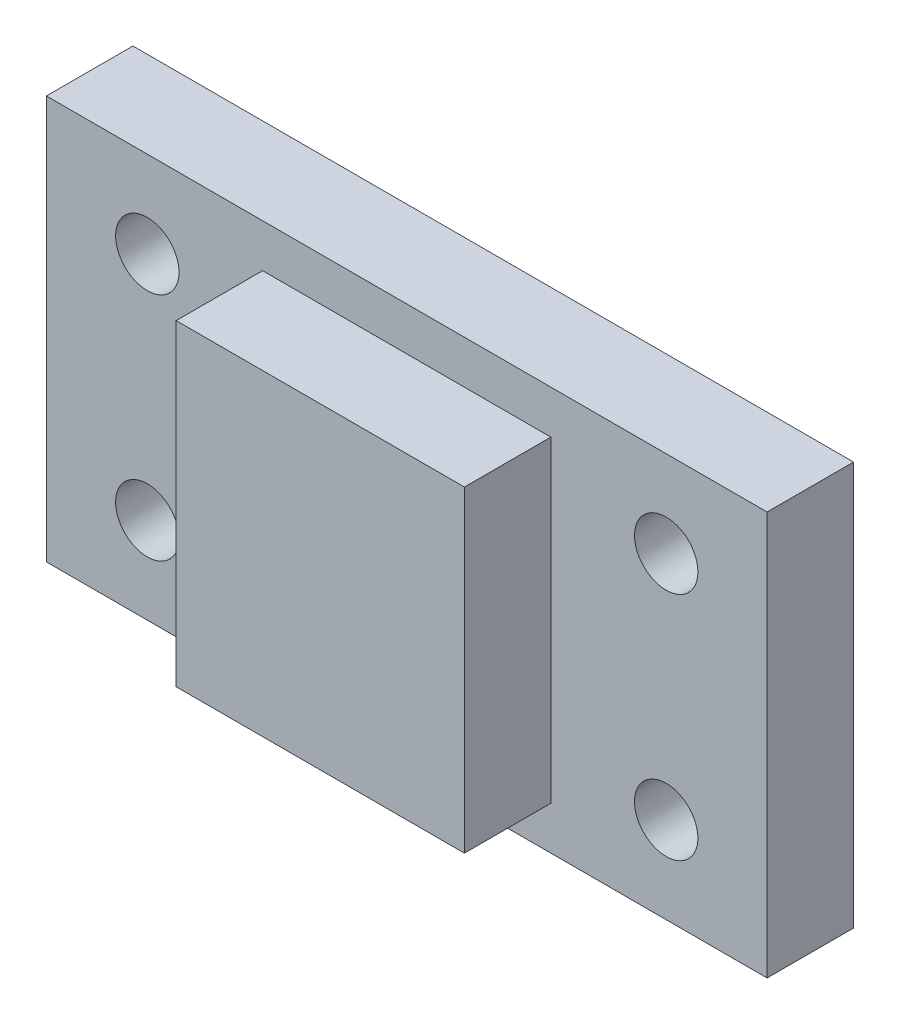
ISO-10303-21;
HEADER;
FILE_DESCRIPTION(('STEP AP214'),'2;1');
FILE_NAME('part.step','',(''),(''),'','','');
FILE_SCHEMA(('AUTOMOTIVE_DESIGN { 1 0 10303 214 1 1 1 1 }'));
ENDSEC;
DATA;
#1=APPLICATION_CONTEXT('core data for automotive mechanical design processes');
#2=APPLICATION_PROTOCOL_DEFINITION('international standard','automotive_design',2000,#1);
#3=PRODUCT_CONTEXT('',#1,'mechanical');
#4=PRODUCT('Part','Part','',(#3));
#5=PRODUCT_RELATED_PRODUCT_CATEGORY('part','',(#4));
#6=PRODUCT_DEFINITION_FORMATION('','',#4);
#7=PRODUCT_DEFINITION_CONTEXT('part definition',#1,'design');
#8=PRODUCT_DEFINITION('design','',#6,#7);
#9=PRODUCT_DEFINITION_SHAPE('','',#8);
#10=(LENGTH_UNIT() NAMED_UNIT(*) SI_UNIT(.MILLI.,.METRE.));
#11=(NAMED_UNIT(*) PLANE_ANGLE_UNIT() SI_UNIT($,.RADIAN.));
#12=(NAMED_UNIT(*) SI_UNIT($,.STERADIAN.) SOLID_ANGLE_UNIT());
#13=UNCERTAINTY_MEASURE_WITH_UNIT(LENGTH_MEASURE(1.E-05),#10,'distance_accuracy_value','');
#14=(GEOMETRIC_REPRESENTATION_CONTEXT(3) GLOBAL_UNCERTAINTY_ASSIGNED_CONTEXT((#13)) GLOBAL_UNIT_ASSIGNED_CONTEXT((#10,
#11,#12)) REPRESENTATION_CONTEXT('',''));
#15=CARTESIAN_POINT('',(0.,0.,0.));
#16=DIRECTION('',(0.,0.,1.));
#17=DIRECTION('',(1.,0.,0.));
#18=AXIS2_PLACEMENT_3D('',#15,#16,#17);
#19=CARTESIAN_POINT('',(64.5,-91.,22.));
#20=DIRECTION('',(0.,0.,-1.));
#21=DIRECTION('',(0.,-1.,0.));
#22=AXIS2_PLACEMENT_3D('',#19,#20,#21);
#23=PLANE('',#22);
#24=DIRECTION('',(0.,1.,0.));
#25=VECTOR('',#24,1.);
#26=CARTESIAN_POINT('',(10.,-96.5,22.));
#27=LINE('',#26,#25);
#28=CARTESIAN_POINT('',(10.,-102.,22.));
#29=VERTEX_POINT('',#28);
#30=CARTESIAN_POINT('',(10.,-80.,22.));
#31=VERTEX_POINT('',#30);
#32=EDGE_CURVE('E50',#29,#31,#27,.T.);
#33=ORIENTED_EDGE('',*,*,#32,.T.);
#34=DIRECTION('',(-1.,0.,0.));
#35=VECTOR('',#34,1.);
#36=CARTESIAN_POINT('',(27.25,-80.,22.));
#37=LINE('',#36,#35);
#38=CARTESIAN_POINT('',(-10.,-80.,22.));
#39=VERTEX_POINT('',#38);
#40=EDGE_CURVE('E36',#31,#39,#37,.T.);
#41=ORIENTED_EDGE('',*,*,#40,.T.);
#42=DIRECTION('',(0.,1.,0.));
#43=VECTOR('',#42,1.);
#44=CARTESIAN_POINT('',(-10.,-96.5,22.));
#45=LINE('',#44,#43);
#46=CARTESIAN_POINT('',(-10.,-102.,22.));
#47=VERTEX_POINT('',#46);
#48=EDGE_CURVE('E193',#47,#39,#45,.T.);
#49=ORIENTED_EDGE('',*,*,#48,.F.);
#50=DIRECTION('',(-1.,0.,0.));
#51=VECTOR('',#50,1.);
#52=CARTESIAN_POINT('',(27.25,-102.,22.));
#53=LINE('',#52,#51);
#54=EDGE_CURVE('E240',#29,#47,#53,.T.);
#55=ORIENTED_EDGE('',*,*,#54,.F.);
#56=EDGE_LOOP('',(#33,#41,#49,#55));
#57=FACE_BOUND('',#56,.T.);
#58=ADVANCED_FACE('F17',(#57),#23,.F.);
#59=CARTESIAN_POINT('',(18.,-83.,9.));
#60=DIRECTION('',(0.,0.,-1.));
#61=DIRECTION('',(1.,0.,0.));
#62=AXIS2_PLACEMENT_3D('',#59,#60,#61);
#63=CYLINDRICAL_SURFACE('',#62,2.2);
#64=CARTESIAN_POINT('',(18.,-83.,10.));
#65=DIRECTION('',(0.,0.,-1.));
#66=DIRECTION('',(1.,0.,0.));
#67=AXIS2_PLACEMENT_3D('',#64,#65,#66);
#68=CIRCLE('',#67,2.2);
#69=CARTESIAN_POINT('',(20.2,-83.,10.));
#70=VERTEX_POINT('',#69);
#71=EDGE_CURVE('E226',#70,#70,#68,.T.);
#72=ORIENTED_EDGE('',*,*,#71,.T.);
#73=DIRECTION('',(0.,0.,1.));
#74=VECTOR('',#73,1.);
#75=CARTESIAN_POINT('',(20.2,-83.,9.));
#76=LINE('',#75,#74);
#77=CARTESIAN_POINT('',(20.2,-83.,16.));
#78=VERTEX_POINT('',#77);
#79=EDGE_CURVE('E11',#70,#78,#76,.T.);
#80=ORIENTED_EDGE('',*,*,#79,.T.);
#81=CARTESIAN_POINT('',(18.,-83.,16.));
#82=DIRECTION('',(0.,0.,-1.));
#83=DIRECTION('',(1.,0.,0.));
#84=AXIS2_PLACEMENT_3D('',#81,#82,#83);
#85=CIRCLE('',#84,2.2);
#86=EDGE_CURVE('E190',#78,#78,#85,.T.);
#87=ORIENTED_EDGE('',*,*,#86,.F.);
#88=ORIENTED_EDGE('',*,*,#79,.F.);
#89=EDGE_LOOP('',(#72,#80,#87,#88));
#90=FACE_BOUND('',#89,.T.);
#91=ADVANCED_FACE('F19',(#90),#63,.F.);
#92=CARTESIAN_POINT('',(-18.,-83.,9.));
#93=DIRECTION('',(0.,0.,-1.));
#94=DIRECTION('',(1.,0.,0.));
#95=AXIS2_PLACEMENT_3D('',#92,#93,#94);
#96=CYLINDRICAL_SURFACE('',#95,2.2);
#97=CARTESIAN_POINT('',(-18.,-83.,10.));
#98=DIRECTION('',(0.,0.,-1.));
#99=DIRECTION('',(1.,0.,0.));
#100=AXIS2_PLACEMENT_3D('',#97,#98,#99);
#101=CIRCLE('',#100,2.2);
#102=CARTESIAN_POINT('',(-15.8,-83.,10.));
#103=VERTEX_POINT('',#102);
#104=EDGE_CURVE('E225',#103,#103,#101,.T.);
#105=ORIENTED_EDGE('',*,*,#104,.T.);
#106=DIRECTION('',(0.,0.,1.));
#107=VECTOR('',#106,1.);
#108=CARTESIAN_POINT('',(-15.8,-83.,9.));
#109=LINE('',#108,#107);
#110=CARTESIAN_POINT('',(-15.8,-83.,16.));
#111=VERTEX_POINT('',#110);
#112=EDGE_CURVE('E27',#103,#111,#109,.T.);
#113=ORIENTED_EDGE('',*,*,#112,.T.);
#114=CARTESIAN_POINT('',(-18.,-83.,16.));
#115=DIRECTION('',(0.,0.,-1.));
#116=DIRECTION('',(1.,0.,0.));
#117=AXIS2_PLACEMENT_3D('',#114,#115,#116);
#118=CIRCLE('',#117,2.2);
#119=EDGE_CURVE('E183',#111,#111,#118,.T.);
#120=ORIENTED_EDGE('',*,*,#119,.F.);
#121=ORIENTED_EDGE('',*,*,#112,.F.);
#122=EDGE_LOOP('',(#105,#113,#120,#121));
#123=FACE_BOUND('',#122,.T.);
#124=ADVANCED_FACE('F309',(#123),#96,.F.);
#125=CARTESIAN_POINT('',(-10.,-80.,16.));
#126=DIRECTION('',(0.,1.,0.));
#127=DIRECTION('',(1.,0.,0.));
#128=AXIS2_PLACEMENT_3D('',#125,#126,#127);
#129=PLANE('',#128);
#130=DIRECTION('',(0.,0.,1.));
#131=VECTOR('',#130,1.);
#132=CARTESIAN_POINT('',(10.,-80.,16.));
#133=LINE('',#132,#131);
#134=CARTESIAN_POINT('',(10.,-80.,16.));
#135=VERTEX_POINT('',#134);
#136=EDGE_CURVE('E202',#135,#31,#133,.T.);
#137=ORIENTED_EDGE('',*,*,#136,.F.);
#138=DIRECTION('',(1.,0.,0.));
#139=VECTOR('',#138,1.);
#140=CARTESIAN_POINT('',(-10.,-80.,16.));
#141=LINE('',#140,#139);
#142=CARTESIAN_POINT('',(-10.,-80.,16.));
#143=VERTEX_POINT('',#142);
#144=EDGE_CURVE('E180',#143,#135,#141,.T.);
#145=ORIENTED_EDGE('',*,*,#144,.F.);
#146=DIRECTION('',(0.,0.,1.));
#147=VECTOR('',#146,1.);
#148=CARTESIAN_POINT('',(-10.,-80.,16.));
#149=LINE('',#148,#147);
#150=EDGE_CURVE('E192',#143,#39,#149,.T.);
#151=ORIENTED_EDGE('',*,*,#150,.T.);
#152=ORIENTED_EDGE('',*,*,#40,.F.);
#153=EDGE_LOOP('',(#137,#145,#151,#152));
#154=FACE_BOUND('',#153,.T.);
#155=ADVANCED_FACE('F332',(#154),#129,.T.);
#156=CARTESIAN_POINT('',(10.,-102.,16.));
#157=DIRECTION('',(1.,0.,0.));
#158=DIRECTION('',(0.,1.,0.));
#159=AXIS2_PLACEMENT_3D('',#156,#157,#158);
#160=PLANE('',#159);
#161=ORIENTED_EDGE('',*,*,#32,.F.);
#162=DIRECTION('',(0.,0.,1.));
#163=VECTOR('',#162,1.);
#164=CARTESIAN_POINT('',(10.,-102.,16.));
#165=LINE('',#164,#163);
#166=CARTESIAN_POINT('',(10.,-102.,16.));
#167=VERTEX_POINT('',#166);
#168=EDGE_CURVE('E217',#167,#29,#165,.T.);
#169=ORIENTED_EDGE('',*,*,#168,.F.);
#170=DIRECTION('',(0.,1.,0.));
#171=VECTOR('',#170,1.);
#172=CARTESIAN_POINT('',(10.,-102.,16.));
#173=LINE('',#172,#171);
#174=EDGE_CURVE('E181',#167,#135,#173,.T.);
#175=ORIENTED_EDGE('',*,*,#174,.T.);
#176=ORIENTED_EDGE('',*,*,#136,.T.);
#177=EDGE_LOOP('',(#161,#169,#175,#176));
#178=FACE_BOUND('',#177,.T.);
#179=ADVANCED_FACE('F242',(#178),#160,.T.);
#180=CARTESIAN_POINT('',(-10.,-102.,16.));
#181=DIRECTION('',(0.,1.,0.));
#182=DIRECTION('',(1.,0.,0.));
#183=AXIS2_PLACEMENT_3D('',#180,#181,#182);
#184=PLANE('',#183);
#185=ORIENTED_EDGE('',*,*,#54,.T.);
#186=DIRECTION('',(0.,0.,1.));
#187=VECTOR('',#186,1.);
#188=CARTESIAN_POINT('',(-10.,-102.,16.));
#189=LINE('',#188,#187);
#190=CARTESIAN_POINT('',(-10.,-102.,16.));
#191=VERTEX_POINT('',#190);
#192=EDGE_CURVE('E188',#191,#47,#189,.T.);
#193=ORIENTED_EDGE('',*,*,#192,.F.);
#194=DIRECTION('',(1.,0.,0.));
#195=VECTOR('',#194,1.);
#196=CARTESIAN_POINT('',(-10.,-102.,16.));
#197=LINE('',#196,#195);
#198=EDGE_CURVE('E187',#191,#167,#197,.T.);
#199=ORIENTED_EDGE('',*,*,#198,.T.);
#200=ORIENTED_EDGE('',*,*,#168,.T.);
#201=EDGE_LOOP('',(#185,#193,#199,#200));
#202=FACE_BOUND('',#201,.T.);
#203=ADVANCED_FACE('F249',(#202),#184,.F.);
#204=CARTESIAN_POINT('',(-10.,-102.,16.));
#205=DIRECTION('',(1.,0.,0.));
#206=DIRECTION('',(0.,1.,0.));
#207=AXIS2_PLACEMENT_3D('',#204,#205,#206);
#208=PLANE('',#207);
#209=ORIENTED_EDGE('',*,*,#150,.F.);
#210=DIRECTION('',(0.,1.,0.));
#211=VECTOR('',#210,1.);
#212=CARTESIAN_POINT('',(-10.,-102.,16.));
#213=LINE('',#212,#211);
#214=EDGE_CURVE('E173',#191,#143,#213,.T.);
#215=ORIENTED_EDGE('',*,*,#214,.F.);
#216=ORIENTED_EDGE('',*,*,#192,.T.);
#217=ORIENTED_EDGE('',*,*,#48,.T.);
#218=EDGE_LOOP('',(#209,#215,#216,#217));
#219=FACE_BOUND('',#218,.T.);
#220=ADVANCED_FACE('F319',(#219),#208,.F.);
#221=CARTESIAN_POINT('',(18.,-99.,9.));
#222=DIRECTION('',(0.,0.,-1.));
#223=DIRECTION('',(1.,0.,0.));
#224=AXIS2_PLACEMENT_3D('',#221,#222,#223);
#225=CYLINDRICAL_SURFACE('',#224,2.2);
#226=CARTESIAN_POINT('',(18.,-99.,10.));
#227=DIRECTION('',(0.,0.,-1.));
#228=DIRECTION('',(1.,0.,0.));
#229=AXIS2_PLACEMENT_3D('',#226,#227,#228);
#230=CIRCLE('',#229,2.2);
#231=CARTESIAN_POINT('',(20.2,-99.,10.));
#232=VERTEX_POINT('',#231);
#233=EDGE_CURVE('E214',#232,#232,#230,.T.);
#234=ORIENTED_EDGE('',*,*,#233,.T.);
#235=DIRECTION('',(0.,0.,1.));
#236=VECTOR('',#235,1.);
#237=CARTESIAN_POINT('',(20.2,-99.,9.));
#238=LINE('',#237,#236);
#239=CARTESIAN_POINT('',(20.2,-99.,16.));
#240=VERTEX_POINT('',#239);
#241=EDGE_CURVE('E210',#232,#240,#238,.T.);
#242=ORIENTED_EDGE('',*,*,#241,.T.);
#243=CARTESIAN_POINT('',(18.,-99.,16.));
#244=DIRECTION('',(0.,0.,-1.));
#245=DIRECTION('',(1.,0.,0.));
#246=AXIS2_PLACEMENT_3D('',#243,#244,#245);
#247=CIRCLE('',#246,2.2);
#248=EDGE_CURVE('E179',#240,#240,#247,.T.);
#249=ORIENTED_EDGE('',*,*,#248,.F.);
#250=ORIENTED_EDGE('',*,*,#241,.F.);
#251=EDGE_LOOP('',(#234,#242,#249,#250));
#252=FACE_BOUND('',#251,.T.);
#253=ADVANCED_FACE('F325',(#252),#225,.F.);
#254=CARTESIAN_POINT('',(-18.,-99.,9.));
#255=DIRECTION('',(0.,0.,-1.));
#256=DIRECTION('',(1.,0.,0.));
#257=AXIS2_PLACEMENT_3D('',#254,#255,#256);
#258=CYLINDRICAL_SURFACE('',#257,2.2);
#259=CARTESIAN_POINT('',(-18.,-99.,10.));
#260=DIRECTION('',(0.,0.,-1.));
#261=DIRECTION('',(1.,0.,0.));
#262=AXIS2_PLACEMENT_3D('',#259,#260,#261);
#263=CIRCLE('',#262,2.2);
#264=CARTESIAN_POINT('',(-15.8,-99.,10.));
#265=VERTEX_POINT('',#264);
#266=EDGE_CURVE('E211',#265,#265,#263,.T.);
#267=ORIENTED_EDGE('',*,*,#266,.T.);
#268=DIRECTION('',(0.,0.,1.));
#269=VECTOR('',#268,1.);
#270=CARTESIAN_POINT('',(-15.8,-99.,9.));
#271=LINE('',#270,#269);
#272=CARTESIAN_POINT('',(-15.8,-99.,16.));
#273=VERTEX_POINT('',#272);
#274=EDGE_CURVE('E230',#265,#273,#271,.T.);
#275=ORIENTED_EDGE('',*,*,#274,.T.);
#276=CARTESIAN_POINT('',(-18.,-99.,16.));
#277=DIRECTION('',(0.,0.,-1.));
#278=DIRECTION('',(1.,0.,0.));
#279=AXIS2_PLACEMENT_3D('',#276,#277,#278);
#280=CIRCLE('',#279,2.2);
#281=EDGE_CURVE('E160',#273,#273,#280,.T.);
#282=ORIENTED_EDGE('',*,*,#281,.F.);
#283=ORIENTED_EDGE('',*,*,#274,.F.);
#284=EDGE_LOOP('',(#267,#275,#282,#283));
#285=FACE_BOUND('',#284,.T.);
#286=ADVANCED_FACE('F299',(#285),#258,.F.);
#287=CARTESIAN_POINT('',(25.,-105.,10.));
#288=DIRECTION('',(1.,0.,0.));
#289=DIRECTION('',(0.,1.,0.));
#290=AXIS2_PLACEMENT_3D('',#287,#288,#289);
#291=PLANE('',#290);
#292=DIRECTION('',(0.,0.,1.));
#293=VECTOR('',#292,1.);
#294=CARTESIAN_POINT('',(25.,-105.,10.));
#295=LINE('',#294,#293);
#296=CARTESIAN_POINT('',(25.,-105.,10.));
#297=VERTEX_POINT('',#296);
#298=CARTESIAN_POINT('',(25.,-105.,16.));
#299=VERTEX_POINT('',#298);
#300=EDGE_CURVE('E257',#297,#299,#295,.T.);
#301=ORIENTED_EDGE('',*,*,#300,.F.);
#302=DIRECTION('',(0.,1.,0.));
#303=VECTOR('',#302,1.);
#304=CARTESIAN_POINT('',(25.,-105.,10.));
#305=LINE('',#304,#303);
#306=CARTESIAN_POINT('',(25.,-77.,10.));
#307=VERTEX_POINT('',#306);
#308=EDGE_CURVE('E142',#297,#307,#305,.T.);
#309=ORIENTED_EDGE('',*,*,#308,.T.);
#310=DIRECTION('',(0.,0.,1.));
#311=VECTOR('',#310,1.);
#312=CARTESIAN_POINT('',(25.,-77.,10.));
#313=LINE('',#312,#311);
#314=CARTESIAN_POINT('',(25.,-77.,16.));
#315=VERTEX_POINT('',#314);
#316=EDGE_CURVE('E134',#307,#315,#313,.T.);
#317=ORIENTED_EDGE('',*,*,#316,.T.);
#318=DIRECTION('',(0.,1.,0.));
#319=VECTOR('',#318,1.);
#320=CARTESIAN_POINT('',(25.,-105.,16.));
#321=LINE('',#320,#319);
#322=EDGE_CURVE('E139',#299,#315,#321,.T.);
#323=ORIENTED_EDGE('',*,*,#322,.F.);
#324=EDGE_LOOP('',(#301,#309,#317,#323));
#325=FACE_BOUND('',#324,.T.);
#326=ADVANCED_FACE('F138',(#325),#291,.T.);
#327=CARTESIAN_POINT('',(-25.,-105.,10.));
#328=DIRECTION('',(0.,0.,1.));
#329=DIRECTION('',(1.,0.,0.));
#330=AXIS2_PLACEMENT_3D('',#327,#328,#329);
#331=PLANE('',#330);
#332=ORIENTED_EDGE('',*,*,#71,.F.);
#333=EDGE_LOOP('',(#332));
#334=FACE_BOUND('',#333,.T.);
#335=ORIENTED_EDGE('',*,*,#104,.F.);
#336=EDGE_LOOP('',(#335));
#337=FACE_BOUND('',#336,.T.);
#338=ORIENTED_EDGE('',*,*,#233,.F.);
#339=EDGE_LOOP('',(#338));
#340=FACE_BOUND('',#339,.T.);
#341=ORIENTED_EDGE('',*,*,#266,.F.);
#342=EDGE_LOOP('',(#341));
#343=FACE_BOUND('',#342,.T.);
#344=DIRECTION('',(1.,0.,0.));
#345=VECTOR('',#344,1.);
#346=CARTESIAN_POINT('',(-25.,-77.,10.));
#347=LINE('',#346,#345);
#348=CARTESIAN_POINT('',(-25.,-77.,10.));
#349=VERTEX_POINT('',#348);
#350=EDGE_CURVE('E148',#349,#307,#347,.T.);
#351=ORIENTED_EDGE('',*,*,#350,.T.);
#352=ORIENTED_EDGE('',*,*,#308,.F.);
#353=DIRECTION('',(1.,0.,0.));
#354=VECTOR('',#353,1.);
#355=CARTESIAN_POINT('',(-25.,-105.,10.));
#356=LINE('',#355,#354);
#357=CARTESIAN_POINT('',(-25.,-105.,10.));
#358=VERTEX_POINT('',#357);
#359=EDGE_CURVE('E162',#358,#297,#356,.T.);
#360=ORIENTED_EDGE('',*,*,#359,.F.);
#361=DIRECTION('',(0.,1.,0.));
#362=VECTOR('',#361,1.);
#363=CARTESIAN_POINT('',(-25.,-105.,10.));
#364=LINE('',#363,#362);
#365=EDGE_CURVE('E275',#358,#349,#364,.T.);
#366=ORIENTED_EDGE('',*,*,#365,.T.);
#367=EDGE_LOOP('',(#351,#352,#360,#366));
#368=FACE_BOUND('',#367,.T.);
#369=ADVANCED_FACE('F288',(#334,#337,#340,#343,#368),#331,.F.);
#370=CARTESIAN_POINT('',(-25.,-77.,10.));
#371=DIRECTION('',(0.,1.,0.));
#372=DIRECTION('',(1.,0.,0.));
#373=AXIS2_PLACEMENT_3D('',#370,#371,#372);
#374=PLANE('',#373);
#375=ORIENTED_EDGE('',*,*,#350,.F.);
#376=DIRECTION('',(0.,0.,1.));
#377=VECTOR('',#376,1.);
#378=CARTESIAN_POINT('',(-25.,-77.,10.));
#379=LINE('',#378,#377);
#380=CARTESIAN_POINT('',(-25.,-77.,16.));
#381=VERTEX_POINT('',#380);
#382=EDGE_CURVE('E155',#349,#381,#379,.T.);
#383=ORIENTED_EDGE('',*,*,#382,.T.);
#384=DIRECTION('',(1.,0.,0.));
#385=VECTOR('',#384,1.);
#386=CARTESIAN_POINT('',(-25.,-77.,16.));
#387=LINE('',#386,#385);
#388=EDGE_CURVE('E149',#381,#315,#387,.T.);
#389=ORIENTED_EDGE('',*,*,#388,.T.);
#390=ORIENTED_EDGE('',*,*,#316,.F.);
#391=EDGE_LOOP('',(#375,#383,#389,#390));
#392=FACE_BOUND('',#391,.T.);
#393=ADVANCED_FACE('F147',(#392),#374,.T.);
#394=CARTESIAN_POINT('',(-25.,-105.,16.));
#395=DIRECTION('',(0.,0.,1.));
#396=DIRECTION('',(1.,0.,0.));
#397=AXIS2_PLACEMENT_3D('',#394,#395,#396);
#398=PLANE('',#397);
#399=ORIENTED_EDGE('',*,*,#86,.T.);
#400=EDGE_LOOP('',(#399));
#401=FACE_BOUND('',#400,.T.);
#402=ORIENTED_EDGE('',*,*,#119,.T.);
#403=EDGE_LOOP('',(#402));
#404=FACE_BOUND('',#403,.T.);
#405=ORIENTED_EDGE('',*,*,#214,.T.);
#406=ORIENTED_EDGE('',*,*,#144,.T.);
#407=ORIENTED_EDGE('',*,*,#174,.F.);
#408=ORIENTED_EDGE('',*,*,#198,.F.);
#409=EDGE_LOOP('',(#405,#406,#407,#408));
#410=FACE_BOUND('',#409,.T.);
#411=ORIENTED_EDGE('',*,*,#248,.T.);
#412=EDGE_LOOP('',(#411));
#413=FACE_BOUND('',#412,.T.);
#414=ORIENTED_EDGE('',*,*,#281,.T.);
#415=EDGE_LOOP('',(#414));
#416=FACE_BOUND('',#415,.T.);
#417=DIRECTION('',(0.,1.,0.));
#418=VECTOR('',#417,1.);
#419=CARTESIAN_POINT('',(-25.,-105.,16.));
#420=LINE('',#419,#418);
#421=CARTESIAN_POINT('',(-25.,-105.,16.));
#422=VERTEX_POINT('',#421);
#423=EDGE_CURVE('E278',#422,#381,#420,.T.);
#424=ORIENTED_EDGE('',*,*,#423,.F.);
#425=DIRECTION('',(1.,0.,0.));
#426=VECTOR('',#425,1.);
#427=CARTESIAN_POINT('',(-25.,-105.,16.));
#428=LINE('',#427,#426);
#429=EDGE_CURVE('E159',#422,#299,#428,.T.);
#430=ORIENTED_EDGE('',*,*,#429,.T.);
#431=ORIENTED_EDGE('',*,*,#322,.T.);
#432=ORIENTED_EDGE('',*,*,#388,.F.);
#433=EDGE_LOOP('',(#424,#430,#431,#432));
#434=FACE_BOUND('',#433,.T.);
#435=ADVANCED_FACE('F157',(#401,#404,#410,#413,#416,#434),#398,.T.);
#436=CARTESIAN_POINT('',(-25.,-105.,10.));
#437=DIRECTION('',(0.,1.,0.));
#438=DIRECTION('',(1.,0.,0.));
#439=AXIS2_PLACEMENT_3D('',#436,#437,#438);
#440=PLANE('',#439);
#441=ORIENTED_EDGE('',*,*,#300,.T.);
#442=ORIENTED_EDGE('',*,*,#429,.F.);
#443=DIRECTION('',(0.,0.,1.));
#444=VECTOR('',#443,1.);
#445=CARTESIAN_POINT('',(-25.,-105.,10.));
#446=LINE('',#445,#444);
#447=EDGE_CURVE('E263',#358,#422,#446,.T.);
#448=ORIENTED_EDGE('',*,*,#447,.F.);
#449=ORIENTED_EDGE('',*,*,#359,.T.);
#450=EDGE_LOOP('',(#441,#442,#448,#449));
#451=FACE_BOUND('',#450,.T.);
#452=ADVANCED_FACE('F289',(#451),#440,.F.);
#453=CARTESIAN_POINT('',(-25.,-105.,10.));
#454=DIRECTION('',(1.,0.,0.));
#455=DIRECTION('',(0.,1.,0.));
#456=AXIS2_PLACEMENT_3D('',#453,#454,#455);
#457=PLANE('',#456);
#458=ORIENTED_EDGE('',*,*,#423,.T.);
#459=ORIENTED_EDGE('',*,*,#382,.F.);
#460=ORIENTED_EDGE('',*,*,#365,.F.);
#461=ORIENTED_EDGE('',*,*,#447,.T.);
#462=EDGE_LOOP('',(#458,#459,#460,#461));
#463=FACE_BOUND('',#462,.T.);
#464=ADVANCED_FACE('F283',(#463),#457,.F.);
#465=CLOSED_SHELL('',(#58,#91,#124,#155,#179,#203,#220,#253,#286,#326,#369,#393,#435,#452,#464));
#466=MANIFOLD_SOLID_BREP('B1',#465);
#467=ADVANCED_BREP_SHAPE_REPRESENTATION('',(#18,#466),#14);
#468=SHAPE_DEFINITION_REPRESENTATION(#9,#467);
ENDSEC;
END-ISO-10303-21;
